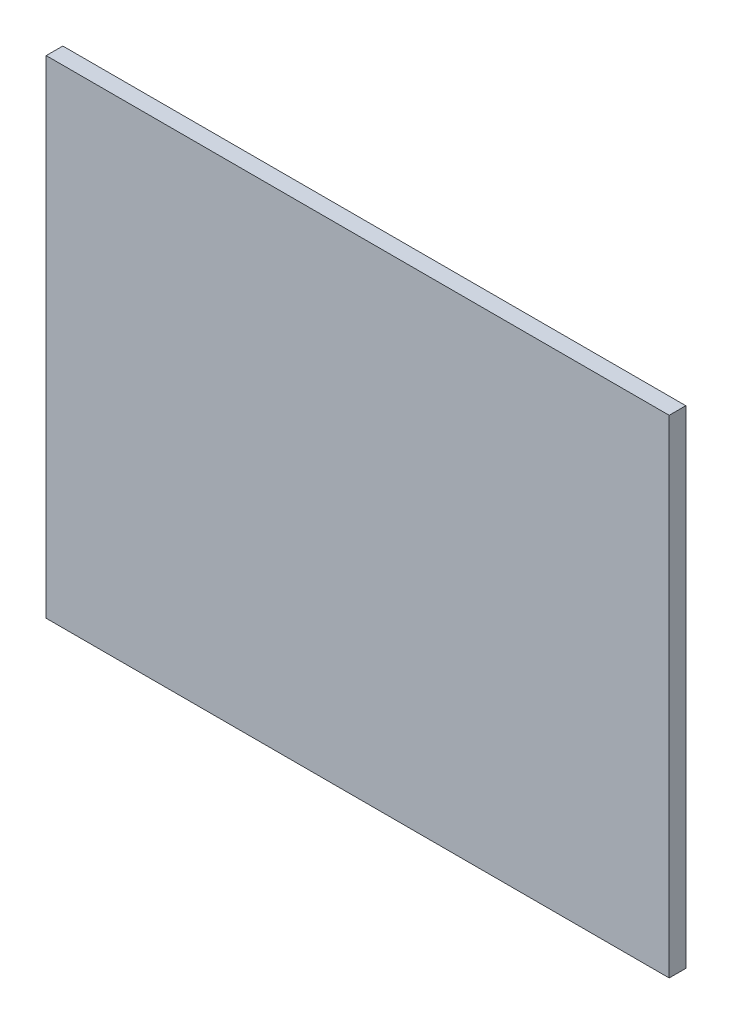
ISO-10303-21;
HEADER;
FILE_DESCRIPTION(('STEP AP214'),'2;1');
FILE_NAME('part.step','',(''),(''),'','','');
FILE_SCHEMA(('AUTOMOTIVE_DESIGN { 1 0 10303 214 1 1 1 1 }'));
ENDSEC;
DATA;
#1=APPLICATION_CONTEXT('core data for automotive mechanical design processes');
#2=APPLICATION_PROTOCOL_DEFINITION('international standard','automotive_design',2000,#1);
#3=PRODUCT_CONTEXT('',#1,'mechanical');
#4=PRODUCT('Part','Part','',(#3));
#5=PRODUCT_RELATED_PRODUCT_CATEGORY('part','',(#4));
#6=PRODUCT_DEFINITION_FORMATION('','',#4);
#7=PRODUCT_DEFINITION_CONTEXT('part definition',#1,'design');
#8=PRODUCT_DEFINITION('design','',#6,#7);
#9=PRODUCT_DEFINITION_SHAPE('','',#8);
#10=(LENGTH_UNIT() NAMED_UNIT(*) SI_UNIT(.MILLI.,.METRE.));
#11=(NAMED_UNIT(*) PLANE_ANGLE_UNIT() SI_UNIT($,.RADIAN.));
#12=(NAMED_UNIT(*) SI_UNIT($,.STERADIAN.) SOLID_ANGLE_UNIT());
#13=UNCERTAINTY_MEASURE_WITH_UNIT(LENGTH_MEASURE(1.E-05),#10,'distance_accuracy_value','');
#14=(GEOMETRIC_REPRESENTATION_CONTEXT(3) GLOBAL_UNCERTAINTY_ASSIGNED_CONTEXT((#13)) GLOBAL_UNIT_ASSIGNED_CONTEXT((#10,
#11,#12)) REPRESENTATION_CONTEXT('',''));
#15=CARTESIAN_POINT('',(0.,0.,0.));
#16=DIRECTION('',(0.,0.,1.));
#17=DIRECTION('',(1.,0.,0.));
#18=AXIS2_PLACEMENT_3D('',#15,#16,#17);
#19=CARTESIAN_POINT('',(112.5,-88.,6.));
#20=DIRECTION('',(-1.,0.,0.));
#21=DIRECTION('',(0.,0.,1.));
#22=AXIS2_PLACEMENT_3D('',#19,#20,#21);
#23=PLANE('',#22);
#24=DIRECTION('',(0.,1.,0.));
#25=VECTOR('',#24,1.);
#26=CARTESIAN_POINT('',(112.5,-88.,0.));
#27=LINE('',#26,#25);
#28=CARTESIAN_POINT('',(112.5,-88.,0.));
#29=VERTEX_POINT('',#28);
#30=CARTESIAN_POINT('',(112.5,88.,0.));
#31=VERTEX_POINT('',#30);
#32=EDGE_CURVE('E96',#29,#31,#27,.T.);
#33=ORIENTED_EDGE('',*,*,#32,.T.);
#34=DIRECTION('',(0.,0.,-1.));
#35=VECTOR('',#34,1.);
#36=CARTESIAN_POINT('',(112.5,88.,6.));
#37=LINE('',#36,#35);
#38=CARTESIAN_POINT('',(112.5,88.,6.));
#39=VERTEX_POINT('',#38);
#40=EDGE_CURVE('E11',#39,#31,#37,.T.);
#41=ORIENTED_EDGE('',*,*,#40,.F.);
#42=DIRECTION('',(0.,1.,0.));
#43=VECTOR('',#42,1.);
#44=CARTESIAN_POINT('',(112.5,-88.,6.));
#45=LINE('',#44,#43);
#46=CARTESIAN_POINT('',(112.5,-88.,6.));
#47=VERTEX_POINT('',#46);
#48=EDGE_CURVE('E84',#47,#39,#45,.T.);
#49=ORIENTED_EDGE('',*,*,#48,.F.);
#50=DIRECTION('',(0.,0.,-1.));
#51=VECTOR('',#50,1.);
#52=CARTESIAN_POINT('',(112.5,-88.,6.));
#53=LINE('',#52,#51);
#54=EDGE_CURVE('E92',#47,#29,#53,.T.);
#55=ORIENTED_EDGE('',*,*,#54,.T.);
#56=EDGE_LOOP('',(#33,#41,#49,#55));
#57=FACE_BOUND('',#56,.T.);
#58=ADVANCED_FACE('F33',(#57),#23,.F.);
#59=CARTESIAN_POINT('',(-112.5,88.,6.));
#60=DIRECTION('',(0.,-1.,0.));
#61=DIRECTION('',(0.,0.,-1.));
#62=AXIS2_PLACEMENT_3D('',#59,#60,#61);
#63=PLANE('',#62);
#64=DIRECTION('',(-1.,0.,0.));
#65=VECTOR('',#64,1.);
#66=CARTESIAN_POINT('',(-112.5,88.,0.));
#67=LINE('',#66,#65);
#68=CARTESIAN_POINT('',(-112.5,88.,0.));
#69=VERTEX_POINT('',#68);
#70=EDGE_CURVE('E88',#31,#69,#67,.T.);
#71=ORIENTED_EDGE('',*,*,#70,.T.);
#72=DIRECTION('',(0.,0.,-1.));
#73=VECTOR('',#72,1.);
#74=CARTESIAN_POINT('',(-112.5,88.,6.));
#75=LINE('',#74,#73);
#76=CARTESIAN_POINT('',(-112.5,88.,6.));
#77=VERTEX_POINT('',#76);
#78=EDGE_CURVE('E41',#77,#69,#75,.T.);
#79=ORIENTED_EDGE('',*,*,#78,.F.);
#80=DIRECTION('',(-1.,0.,0.));
#81=VECTOR('',#80,1.);
#82=CARTESIAN_POINT('',(-112.5,88.,6.));
#83=LINE('',#82,#81);
#84=EDGE_CURVE('E79',#39,#77,#83,.T.);
#85=ORIENTED_EDGE('',*,*,#84,.F.);
#86=ORIENTED_EDGE('',*,*,#40,.T.);
#87=EDGE_LOOP('',(#71,#79,#85,#86));
#88=FACE_BOUND('',#87,.T.);
#89=ADVANCED_FACE('F87',(#88),#63,.F.);
#90=CARTESIAN_POINT('',(-112.5,-88.,6.));
#91=DIRECTION('',(1.,0.,0.));
#92=DIRECTION('',(0.,0.,-1.));
#93=AXIS2_PLACEMENT_3D('',#90,#91,#92);
#94=PLANE('',#93);
#95=DIRECTION('',(0.,-1.,0.));
#96=VECTOR('',#95,1.);
#97=CARTESIAN_POINT('',(-112.5,-88.,0.));
#98=LINE('',#97,#96);
#99=CARTESIAN_POINT('',(-112.5,-88.,0.));
#100=VERTEX_POINT('',#99);
#101=EDGE_CURVE('E66',#69,#100,#98,.T.);
#102=ORIENTED_EDGE('',*,*,#101,.T.);
#103=DIRECTION('',(0.,0.,-1.));
#104=VECTOR('',#103,1.);
#105=CARTESIAN_POINT('',(-112.5,-88.,6.));
#106=LINE('',#105,#104);
#107=CARTESIAN_POINT('',(-112.5,-88.,6.));
#108=VERTEX_POINT('',#107);
#109=EDGE_CURVE('E89',#108,#100,#106,.T.);
#110=ORIENTED_EDGE('',*,*,#109,.F.);
#111=DIRECTION('',(0.,-1.,0.));
#112=VECTOR('',#111,1.);
#113=CARTESIAN_POINT('',(-112.5,-88.,6.));
#114=LINE('',#113,#112);
#115=EDGE_CURVE('E82',#77,#108,#114,.T.);
#116=ORIENTED_EDGE('',*,*,#115,.F.);
#117=ORIENTED_EDGE('',*,*,#78,.T.);
#118=EDGE_LOOP('',(#102,#110,#116,#117));
#119=FACE_BOUND('',#118,.T.);
#120=ADVANCED_FACE('F90',(#119),#94,.F.);
#121=CARTESIAN_POINT('',(-112.5,-88.,6.));
#122=DIRECTION('',(0.,1.,0.));
#123=DIRECTION('',(0.,0.,1.));
#124=AXIS2_PLACEMENT_3D('',#121,#122,#123);
#125=PLANE('',#124);
#126=DIRECTION('',(1.,0.,0.));
#127=VECTOR('',#126,1.);
#128=CARTESIAN_POINT('',(-112.5,-88.,0.));
#129=LINE('',#128,#127);
#130=EDGE_CURVE('E72',#100,#29,#129,.T.);
#131=ORIENTED_EDGE('',*,*,#130,.T.);
#132=ORIENTED_EDGE('',*,*,#54,.F.);
#133=DIRECTION('',(1.,0.,0.));
#134=VECTOR('',#133,1.);
#135=CARTESIAN_POINT('',(-112.5,-88.,6.));
#136=LINE('',#135,#134);
#137=EDGE_CURVE('E49',#108,#47,#136,.T.);
#138=ORIENTED_EDGE('',*,*,#137,.F.);
#139=ORIENTED_EDGE('',*,*,#109,.T.);
#140=EDGE_LOOP('',(#131,#132,#138,#139));
#141=FACE_BOUND('',#140,.T.);
#142=ADVANCED_FACE('F103',(#141),#125,.F.);
#143=CARTESIAN_POINT('',(0.,0.,6.));
#144=DIRECTION('',(0.,0.,-1.));
#145=DIRECTION('',(-1.,0.,0.));
#146=AXIS2_PLACEMENT_3D('',#143,#144,#145);
#147=PLANE('',#146);
#148=ORIENTED_EDGE('',*,*,#48,.T.);
#149=ORIENTED_EDGE('',*,*,#84,.T.);
#150=ORIENTED_EDGE('',*,*,#115,.T.);
#151=ORIENTED_EDGE('',*,*,#137,.T.);
#152=EDGE_LOOP('',(#148,#149,#150,#151));
#153=FACE_BOUND('',#152,.T.);
#154=ADVANCED_FACE('F80',(#153),#147,.F.);
#155=CARTESIAN_POINT('',(0.,0.,0.));
#156=DIRECTION('',(0.,0.,-1.));
#157=DIRECTION('',(-1.,0.,0.));
#158=AXIS2_PLACEMENT_3D('',#155,#156,#157);
#159=PLANE('',#158);
#160=ORIENTED_EDGE('',*,*,#32,.F.);
#161=ORIENTED_EDGE('',*,*,#130,.F.);
#162=ORIENTED_EDGE('',*,*,#101,.F.);
#163=ORIENTED_EDGE('',*,*,#70,.F.);
#164=EDGE_LOOP('',(#160,#161,#162,#163));
#165=FACE_BOUND('',#164,.T.);
#166=ADVANCED_FACE('F106',(#165),#159,.T.);
#167=CLOSED_SHELL('',(#58,#89,#120,#142,#154,#166));
#168=MANIFOLD_SOLID_BREP('B2',#167);
#169=ADVANCED_BREP_SHAPE_REPRESENTATION('',(#18,#168),#14);
#170=SHAPE_DEFINITION_REPRESENTATION(#9,#169);
ENDSEC;
END-ISO-10303-21;
